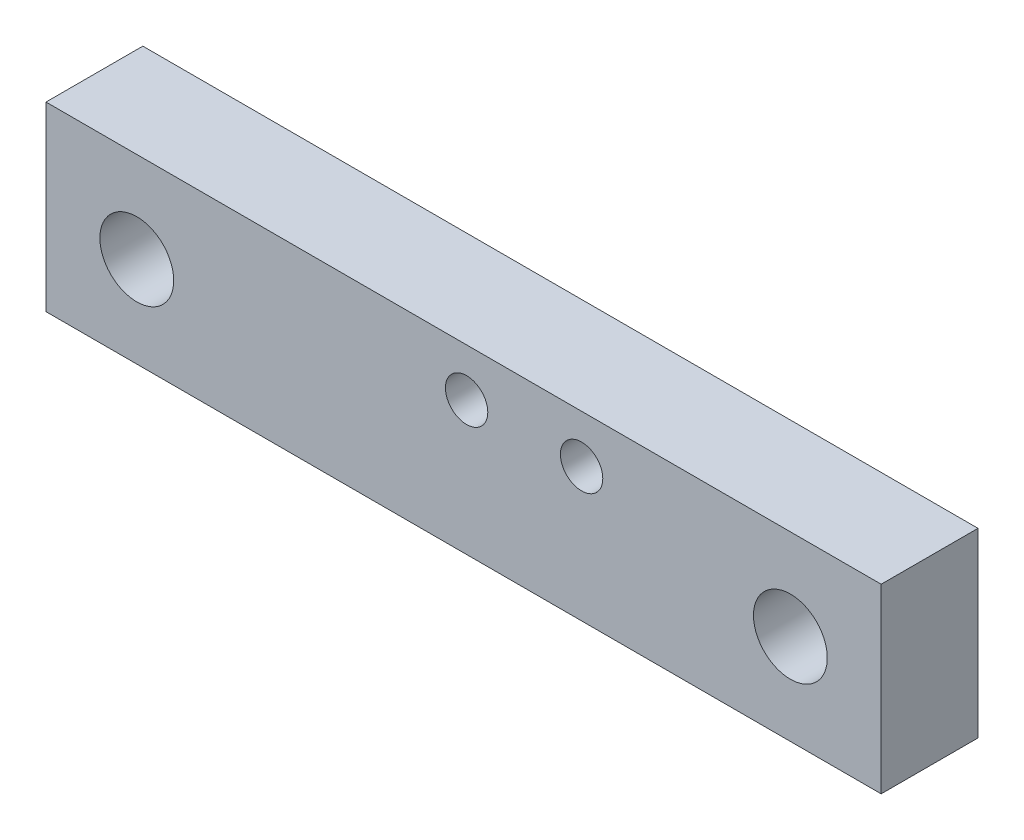
ISO-10303-21;
HEADER;
FILE_DESCRIPTION(('STEP AP214'),'2;1');
FILE_NAME('part.step','',(''),(''),'','','');
FILE_SCHEMA(('AUTOMOTIVE_DESIGN { 1 0 10303 214 1 1 1 1 }'));
ENDSEC;
DATA;
#1=APPLICATION_CONTEXT('core data for automotive mechanical design processes');
#2=APPLICATION_PROTOCOL_DEFINITION('international standard','automotive_design',2000,#1);
#3=PRODUCT_CONTEXT('',#1,'mechanical');
#4=PRODUCT('Part','Part','',(#3));
#5=PRODUCT_RELATED_PRODUCT_CATEGORY('part','',(#4));
#6=PRODUCT_DEFINITION_FORMATION('','',#4);
#7=PRODUCT_DEFINITION_CONTEXT('part definition',#1,'design');
#8=PRODUCT_DEFINITION('design','',#6,#7);
#9=PRODUCT_DEFINITION_SHAPE('','',#8);
#10=(LENGTH_UNIT() NAMED_UNIT(*) SI_UNIT(.MILLI.,.METRE.));
#11=(NAMED_UNIT(*) PLANE_ANGLE_UNIT() SI_UNIT($,.RADIAN.));
#12=(NAMED_UNIT(*) SI_UNIT($,.STERADIAN.) SOLID_ANGLE_UNIT());
#13=UNCERTAINTY_MEASURE_WITH_UNIT(LENGTH_MEASURE(1.E-05),#10,'distance_accuracy_value','');
#14=(GEOMETRIC_REPRESENTATION_CONTEXT(3) GLOBAL_UNCERTAINTY_ASSIGNED_CONTEXT((#13)) GLOBAL_UNIT_ASSIGNED_CONTEXT((#10,
#11,#12)) REPRESENTATION_CONTEXT('',''));
#15=CARTESIAN_POINT('',(0.,0.,0.));
#16=DIRECTION('',(0.,0.,1.));
#17=DIRECTION('',(1.,0.,0.));
#18=AXIS2_PLACEMENT_3D('',#15,#16,#17);
#19=CARTESIAN_POINT('',(0.,0.,8.));
#20=DIRECTION('',(0.,0.,1.));
#21=DIRECTION('',(1.,0.,0.));
#22=AXIS2_PLACEMENT_3D('',#19,#20,#21);
#23=PLANE('',#22);
#24=CARTESIAN_POINT('',(0.25,3.55,8.));
#25=DIRECTION('',(0.,0.,1.));
#26=DIRECTION('',(1.,0.,0.));
#27=AXIS2_PLACEMENT_3D('',#24,#25,#26);
#28=CIRCLE('',#27,1.75);
#29=CARTESIAN_POINT('',(2.,3.55,8.));
#30=VERTEX_POINT('',#29);
#31=EDGE_CURVE('E121',#30,#30,#28,.T.);
#32=ORIENTED_EDGE('',*,*,#31,.F.);
#33=EDGE_LOOP('',(#32));
#34=FACE_BOUND('',#33,.T.);
#35=CARTESIAN_POINT('',(-27.,0.,8.));
#36=DIRECTION('',(0.,0.,1.));
#37=DIRECTION('',(1.,0.,0.));
#38=AXIS2_PLACEMENT_3D('',#35,#36,#37);
#39=CIRCLE('',#38,3.05);
#40=CARTESIAN_POINT('',(-23.95,0.,8.));
#41=VERTEX_POINT('',#40);
#42=EDGE_CURVE('E100',#41,#41,#39,.T.);
#43=ORIENTED_EDGE('',*,*,#42,.F.);
#44=EDGE_LOOP('',(#43));
#45=FACE_BOUND('',#44,.T.);
#46=DIRECTION('',(0.,-1.,0.));
#47=VECTOR('',#46,1.);
#48=CARTESIAN_POINT('',(-34.5,-7.50000000000001,8.));
#49=LINE('',#48,#47);
#50=CARTESIAN_POINT('',(-34.5,7.49999999999999,8.));
#51=VERTEX_POINT('',#50);
#52=CARTESIAN_POINT('',(-34.5,-7.50000000000001,8.));
#53=VERTEX_POINT('',#52);
#54=EDGE_CURVE('E85',#51,#53,#49,.T.);
#55=ORIENTED_EDGE('',*,*,#54,.T.);
#56=DIRECTION('',(1.,0.,0.));
#57=VECTOR('',#56,1.);
#58=CARTESIAN_POINT('',(34.5,-7.5,8.));
#59=LINE('',#58,#57);
#60=CARTESIAN_POINT('',(34.5,-7.5,8.));
#61=VERTEX_POINT('',#60);
#62=EDGE_CURVE('E80',#53,#61,#59,.T.);
#63=ORIENTED_EDGE('',*,*,#62,.T.);
#64=DIRECTION('',(0.,1.,0.));
#65=VECTOR('',#64,1.);
#66=CARTESIAN_POINT('',(34.5,-7.5,8.));
#67=LINE('',#66,#65);
#68=CARTESIAN_POINT('',(34.5,7.5,8.));
#69=VERTEX_POINT('',#68);
#70=EDGE_CURVE('E83',#61,#69,#67,.T.);
#71=ORIENTED_EDGE('',*,*,#70,.T.);
#72=DIRECTION('',(-1.,0.,0.));
#73=VECTOR('',#72,1.);
#74=CARTESIAN_POINT('',(34.5,7.5,8.));
#75=LINE('',#74,#73);
#76=EDGE_CURVE('E50',#69,#51,#75,.T.);
#77=ORIENTED_EDGE('',*,*,#76,.T.);
#78=EDGE_LOOP('',(#55,#63,#71,#77));
#79=FACE_BOUND('',#78,.T.);
#80=CARTESIAN_POINT('',(27.,0.,8.));
#81=DIRECTION('',(0.,0.,1.));
#82=DIRECTION('',(-1.,0.,0.));
#83=AXIS2_PLACEMENT_3D('',#80,#81,#82);
#84=CIRCLE('',#83,3.05);
#85=CARTESIAN_POINT('',(23.95,0.,8.));
#86=VERTEX_POINT('',#85);
#87=EDGE_CURVE('E115',#86,#86,#84,.T.);
#88=ORIENTED_EDGE('',*,*,#87,.F.);
#89=EDGE_LOOP('',(#88));
#90=FACE_BOUND('',#89,.T.);
#91=CARTESIAN_POINT('',(9.75,3.55,8.));
#92=DIRECTION('',(0.,0.,1.));
#93=DIRECTION('',(1.,0.,0.));
#94=AXIS2_PLACEMENT_3D('',#91,#92,#93);
#95=CIRCLE('',#94,1.75);
#96=CARTESIAN_POINT('',(11.5,3.55,8.));
#97=VERTEX_POINT('',#96);
#98=EDGE_CURVE('E127',#97,#97,#95,.T.);
#99=ORIENTED_EDGE('',*,*,#98,.F.);
#100=EDGE_LOOP('',(#99));
#101=FACE_BOUND('',#100,.T.);
#102=ADVANCED_FACE('F33',(#34,#45,#79,#90,#101),#23,.T.);
#103=CARTESIAN_POINT('',(0.,0.,0.));
#104=DIRECTION('',(0.,0.,1.));
#105=DIRECTION('',(1.,0.,0.));
#106=AXIS2_PLACEMENT_3D('',#103,#104,#105);
#107=PLANE('',#106);
#108=CARTESIAN_POINT('',(0.25,3.55,0.));
#109=DIRECTION('',(0.,0.,1.));
#110=DIRECTION('',(1.,0.,0.));
#111=AXIS2_PLACEMENT_3D('',#108,#109,#110);
#112=CIRCLE('',#111,1.75);
#113=CARTESIAN_POINT('',(2.,3.55,0.));
#114=VERTEX_POINT('',#113);
#115=EDGE_CURVE('E124',#114,#114,#112,.T.);
#116=ORIENTED_EDGE('',*,*,#115,.T.);
#117=EDGE_LOOP('',(#116));
#118=FACE_BOUND('',#117,.T.);
#119=CARTESIAN_POINT('',(-27.,0.,0.));
#120=DIRECTION('',(0.,0.,1.));
#121=DIRECTION('',(1.,0.,0.));
#122=AXIS2_PLACEMENT_3D('',#119,#120,#121);
#123=CIRCLE('',#122,3.05);
#124=CARTESIAN_POINT('',(-23.95,0.,0.));
#125=VERTEX_POINT('',#124);
#126=EDGE_CURVE('E112',#125,#125,#123,.T.);
#127=ORIENTED_EDGE('',*,*,#126,.T.);
#128=EDGE_LOOP('',(#127));
#129=FACE_BOUND('',#128,.T.);
#130=DIRECTION('',(0.,-1.,0.));
#131=VECTOR('',#130,1.);
#132=CARTESIAN_POINT('',(-34.5,-7.50000000000001,0.));
#133=LINE('',#132,#131);
#134=CARTESIAN_POINT('',(-34.5,7.49999999999999,0.));
#135=VERTEX_POINT('',#134);
#136=CARTESIAN_POINT('',(-34.5,-7.50000000000001,0.));
#137=VERTEX_POINT('',#136);
#138=EDGE_CURVE('E97',#135,#137,#133,.T.);
#139=ORIENTED_EDGE('',*,*,#138,.F.);
#140=DIRECTION('',(-1.,0.,0.));
#141=VECTOR('',#140,1.);
#142=CARTESIAN_POINT('',(34.5,7.5,0.));
#143=LINE('',#142,#141);
#144=CARTESIAN_POINT('',(34.5,7.5,0.));
#145=VERTEX_POINT('',#144);
#146=EDGE_CURVE('E73',#145,#135,#143,.T.);
#147=ORIENTED_EDGE('',*,*,#146,.F.);
#148=DIRECTION('',(0.,1.,0.));
#149=VECTOR('',#148,1.);
#150=CARTESIAN_POINT('',(34.5,-7.5,0.));
#151=LINE('',#150,#149);
#152=CARTESIAN_POINT('',(34.5,-7.5,0.));
#153=VERTEX_POINT('',#152);
#154=EDGE_CURVE('E67',#153,#145,#151,.T.);
#155=ORIENTED_EDGE('',*,*,#154,.F.);
#156=DIRECTION('',(1.,0.,0.));
#157=VECTOR('',#156,1.);
#158=CARTESIAN_POINT('',(34.5,-7.5,0.));
#159=LINE('',#158,#157);
#160=EDGE_CURVE('E89',#137,#153,#159,.T.);
#161=ORIENTED_EDGE('',*,*,#160,.F.);
#162=EDGE_LOOP('',(#139,#147,#155,#161));
#163=FACE_BOUND('',#162,.T.);
#164=CARTESIAN_POINT('',(27.,0.,0.));
#165=DIRECTION('',(0.,0.,1.));
#166=DIRECTION('',(-1.,0.,0.));
#167=AXIS2_PLACEMENT_3D('',#164,#165,#166);
#168=CIRCLE('',#167,3.05);
#169=CARTESIAN_POINT('',(23.95,0.,0.));
#170=VERTEX_POINT('',#169);
#171=EDGE_CURVE('E118',#170,#170,#168,.T.);
#172=ORIENTED_EDGE('',*,*,#171,.T.);
#173=EDGE_LOOP('',(#172));
#174=FACE_BOUND('',#173,.T.);
#175=CARTESIAN_POINT('',(9.75,3.55,0.));
#176=DIRECTION('',(0.,0.,1.));
#177=DIRECTION('',(1.,0.,0.));
#178=AXIS2_PLACEMENT_3D('',#175,#176,#177);
#179=CIRCLE('',#178,1.75);
#180=CARTESIAN_POINT('',(11.5,3.55,0.));
#181=VERTEX_POINT('',#180);
#182=EDGE_CURVE('E130',#181,#181,#179,.T.);
#183=ORIENTED_EDGE('',*,*,#182,.T.);
#184=EDGE_LOOP('',(#183));
#185=FACE_BOUND('',#184,.T.);
#186=ADVANCED_FACE('F108',(#118,#129,#163,#174,#185),#107,.F.);
#187=CARTESIAN_POINT('',(-34.5,-7.50000000000001,8.));
#188=DIRECTION('',(1.,0.,0.));
#189=DIRECTION('',(0.,0.,-1.));
#190=AXIS2_PLACEMENT_3D('',#187,#188,#189);
#191=PLANE('',#190);
#192=ORIENTED_EDGE('',*,*,#138,.T.);
#193=DIRECTION('',(0.,0.,-1.));
#194=VECTOR('',#193,1.);
#195=CARTESIAN_POINT('',(-34.5,-7.50000000000001,8.));
#196=LINE('',#195,#194);
#197=EDGE_CURVE('E11',#53,#137,#196,.T.);
#198=ORIENTED_EDGE('',*,*,#197,.F.);
#199=ORIENTED_EDGE('',*,*,#54,.F.);
#200=DIRECTION('',(0.,0.,-1.));
#201=VECTOR('',#200,1.);
#202=CARTESIAN_POINT('',(-34.5,7.49999999999999,8.));
#203=LINE('',#202,#201);
#204=EDGE_CURVE('E93',#51,#135,#203,.T.);
#205=ORIENTED_EDGE('',*,*,#204,.T.);
#206=EDGE_LOOP('',(#192,#198,#199,#205));
#207=FACE_BOUND('',#206,.T.);
#208=ADVANCED_FACE('F35',(#207),#191,.F.);
#209=CARTESIAN_POINT('',(34.5,-7.5,8.));
#210=DIRECTION('',(0.,1.,0.));
#211=DIRECTION('',(-1.,0.,0.));
#212=AXIS2_PLACEMENT_3D('',#209,#210,#211);
#213=PLANE('',#212);
#214=ORIENTED_EDGE('',*,*,#160,.T.);
#215=DIRECTION('',(0.,0.,-1.));
#216=VECTOR('',#215,1.);
#217=CARTESIAN_POINT('',(34.5,-7.5,8.));
#218=LINE('',#217,#216);
#219=EDGE_CURVE('E42',#61,#153,#218,.T.);
#220=ORIENTED_EDGE('',*,*,#219,.F.);
#221=ORIENTED_EDGE('',*,*,#62,.F.);
#222=ORIENTED_EDGE('',*,*,#197,.T.);
#223=EDGE_LOOP('',(#214,#220,#221,#222));
#224=FACE_BOUND('',#223,.T.);
#225=ADVANCED_FACE('F88',(#224),#213,.F.);
#226=CARTESIAN_POINT('',(34.5,-7.5,8.));
#227=DIRECTION('',(-1.,0.,0.));
#228=DIRECTION('',(0.,0.,1.));
#229=AXIS2_PLACEMENT_3D('',#226,#227,#228);
#230=PLANE('',#229);
#231=ORIENTED_EDGE('',*,*,#154,.T.);
#232=DIRECTION('',(0.,0.,-1.));
#233=VECTOR('',#232,1.);
#234=CARTESIAN_POINT('',(34.5,7.5,8.));
#235=LINE('',#234,#233);
#236=EDGE_CURVE('E90',#69,#145,#235,.T.);
#237=ORIENTED_EDGE('',*,*,#236,.F.);
#238=ORIENTED_EDGE('',*,*,#70,.F.);
#239=ORIENTED_EDGE('',*,*,#219,.T.);
#240=EDGE_LOOP('',(#231,#237,#238,#239));
#241=FACE_BOUND('',#240,.T.);
#242=ADVANCED_FACE('F91',(#241),#230,.F.);
#243=CARTESIAN_POINT('',(34.5,7.5,8.));
#244=DIRECTION('',(0.,-1.,0.));
#245=DIRECTION('',(1.,0.,0.));
#246=AXIS2_PLACEMENT_3D('',#243,#244,#245);
#247=PLANE('',#246);
#248=ORIENTED_EDGE('',*,*,#146,.T.);
#249=ORIENTED_EDGE('',*,*,#204,.F.);
#250=ORIENTED_EDGE('',*,*,#76,.F.);
#251=ORIENTED_EDGE('',*,*,#236,.T.);
#252=EDGE_LOOP('',(#248,#249,#250,#251));
#253=FACE_BOUND('',#252,.T.);
#254=ADVANCED_FACE('F105',(#253),#247,.F.);
#255=CARTESIAN_POINT('',(-27.,0.,8.));
#256=DIRECTION('',(0.,0.,-1.));
#257=DIRECTION('',(-1.,0.,0.));
#258=AXIS2_PLACEMENT_3D('',#255,#256,#257);
#259=CYLINDRICAL_SURFACE('',#258,3.05);
#260=ORIENTED_EDGE('',*,*,#42,.T.);
#261=EDGE_LOOP('',(#260));
#262=FACE_BOUND('',#261,.T.);
#263=ORIENTED_EDGE('',*,*,#126,.F.);
#264=EDGE_LOOP('',(#263));
#265=FACE_BOUND('',#264,.T.);
#266=ADVANCED_FACE('F150',(#262,#265),#259,.F.);
#267=CARTESIAN_POINT('',(27.,0.,8.));
#268=DIRECTION('',(0.,0.,-1.));
#269=DIRECTION('',(-1.,0.,0.));
#270=AXIS2_PLACEMENT_3D('',#267,#268,#269);
#271=CYLINDRICAL_SURFACE('',#270,3.05);
#272=ORIENTED_EDGE('',*,*,#87,.T.);
#273=EDGE_LOOP('',(#272));
#274=FACE_BOUND('',#273,.T.);
#275=ORIENTED_EDGE('',*,*,#171,.F.);
#276=EDGE_LOOP('',(#275));
#277=FACE_BOUND('',#276,.T.);
#278=ADVANCED_FACE('F196',(#274,#277),#271,.F.);
#279=CARTESIAN_POINT('',(0.25,3.55,8.));
#280=DIRECTION('',(0.,0.,-1.));
#281=DIRECTION('',(-1.,0.,0.));
#282=AXIS2_PLACEMENT_3D('',#279,#280,#281);
#283=CYLINDRICAL_SURFACE('',#282,1.75);
#284=ORIENTED_EDGE('',*,*,#31,.T.);
#285=EDGE_LOOP('',(#284));
#286=FACE_BOUND('',#285,.T.);
#287=ORIENTED_EDGE('',*,*,#115,.F.);
#288=EDGE_LOOP('',(#287));
#289=FACE_BOUND('',#288,.T.);
#290=ADVANCED_FACE('F204',(#286,#289),#283,.F.);
#291=CARTESIAN_POINT('',(9.75,3.55,8.));
#292=DIRECTION('',(0.,0.,-1.));
#293=DIRECTION('',(-1.,0.,0.));
#294=AXIS2_PLACEMENT_3D('',#291,#292,#293);
#295=CYLINDRICAL_SURFACE('',#294,1.75);
#296=ORIENTED_EDGE('',*,*,#98,.T.);
#297=EDGE_LOOP('',(#296));
#298=FACE_BOUND('',#297,.T.);
#299=ORIENTED_EDGE('',*,*,#182,.F.);
#300=EDGE_LOOP('',(#299));
#301=FACE_BOUND('',#300,.T.);
#302=ADVANCED_FACE('F136',(#298,#301),#295,.F.);
#303=CLOSED_SHELL('',(#102,#186,#208,#225,#242,#254,#266,#278,#290,#302));
#304=MANIFOLD_SOLID_BREP('B2',#303);
#305=ADVANCED_BREP_SHAPE_REPRESENTATION('',(#18,#304),#14);
#306=SHAPE_DEFINITION_REPRESENTATION(#9,#305);
ENDSEC;
END-ISO-10303-21;
